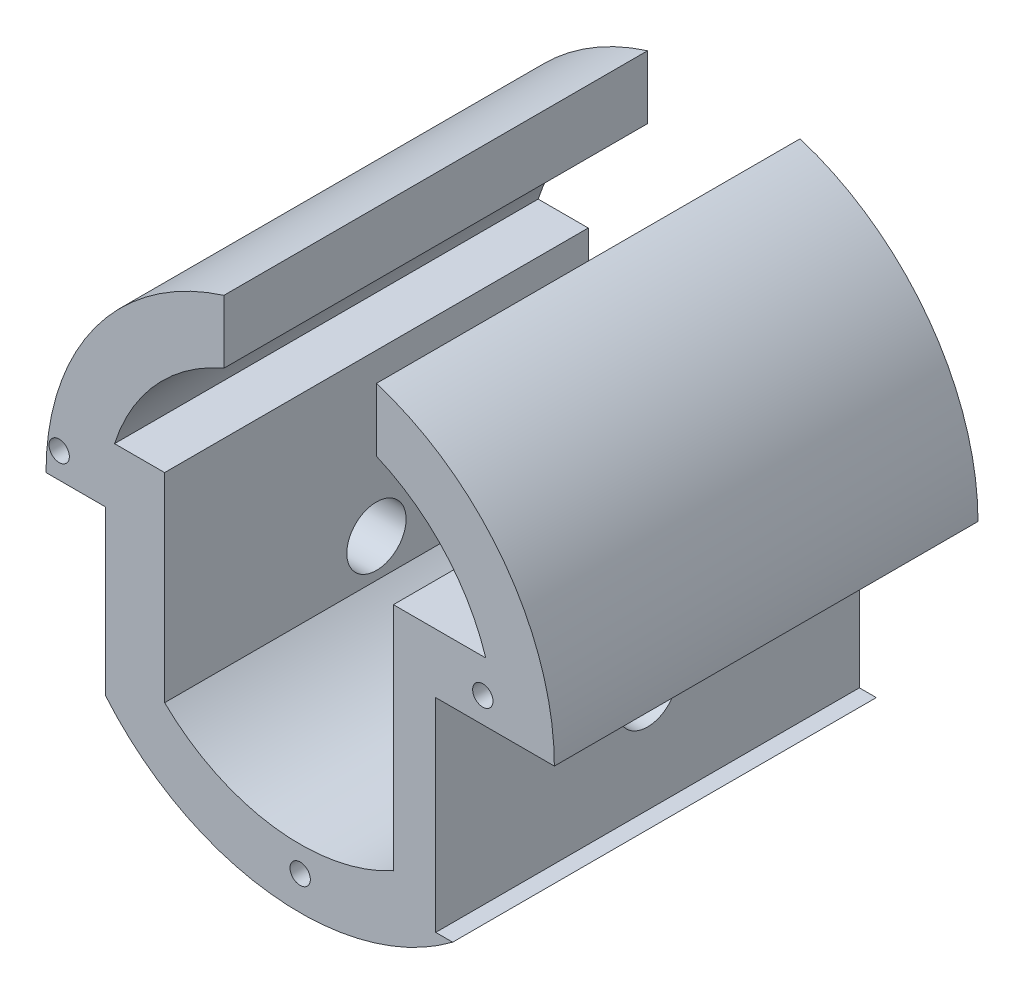
ISO-10303-21;
HEADER;
FILE_DESCRIPTION(('STEP AP214'),'2;1');
FILE_NAME('part.step','',(''),(''),'','','');
FILE_SCHEMA(('AUTOMOTIVE_DESIGN { 1 0 10303 214 1 1 1 1 }'));
ENDSEC;
DATA;
#1=APPLICATION_CONTEXT('core data for automotive mechanical design processes');
#2=APPLICATION_PROTOCOL_DEFINITION('international standard','automotive_design',2000,#1);
#3=PRODUCT_CONTEXT('',#1,'mechanical');
#4=PRODUCT('Part','Part','',(#3));
#5=PRODUCT_RELATED_PRODUCT_CATEGORY('part','',(#4));
#6=PRODUCT_DEFINITION_FORMATION('','',#4);
#7=PRODUCT_DEFINITION_CONTEXT('part definition',#1,'design');
#8=PRODUCT_DEFINITION('design','',#6,#7);
#9=PRODUCT_DEFINITION_SHAPE('','',#8);
#10=(LENGTH_UNIT() NAMED_UNIT(*) SI_UNIT(.MILLI.,.METRE.));
#11=(NAMED_UNIT(*) PLANE_ANGLE_UNIT() SI_UNIT($,.RADIAN.));
#12=(NAMED_UNIT(*) SI_UNIT($,.STERADIAN.) SOLID_ANGLE_UNIT());
#13=UNCERTAINTY_MEASURE_WITH_UNIT(LENGTH_MEASURE(1.E-05),#10,'distance_accuracy_value','');
#14=(GEOMETRIC_REPRESENTATION_CONTEXT(3) GLOBAL_UNCERTAINTY_ASSIGNED_CONTEXT((#13)) GLOBAL_UNIT_ASSIGNED_CONTEXT((#10,
#11,#12)) REPRESENTATION_CONTEXT('',''));
#15=CARTESIAN_POINT('',(0.,0.,0.));
#16=DIRECTION('',(0.,0.,1.));
#17=DIRECTION('',(1.,0.,0.));
#18=AXIS2_PLACEMENT_3D('',#15,#16,#17);
#19=CARTESIAN_POINT('',(18.,-12.,25.));
#20=DIRECTION('',(1.,0.,0.));
#21=DIRECTION('',(0.,0.,-1.));
#22=AXIS2_PLACEMENT_3D('',#19,#20,#21);
#23=CYLINDRICAL_SURFACE('',#22,3.49999998499999);
#24=CARTESIAN_POINT('',(11.,-12.,25.));
#25=DIRECTION('',(1.,0.,0.));
#26=DIRECTION('',(0.,1.,0.));
#27=AXIS2_PLACEMENT_3D('',#24,#25,#26);
#28=CIRCLE('',#27,3.49999998499999);
#29=CARTESIAN_POINT('',(11.,-8.500000015,25.));
#30=VERTEX_POINT('',#29);
#31=EDGE_CURVE('E254',#30,#30,#28,.T.);
#32=ORIENTED_EDGE('',*,*,#31,.F.);
#33=EDGE_LOOP('',(#32));
#34=FACE_BOUND('',#33,.T.);
#35=CARTESIAN_POINT('',(16.,-12.,25.));
#36=DIRECTION('',(1.,0.,0.));
#37=DIRECTION('',(0.,1.,0.));
#38=AXIS2_PLACEMENT_3D('',#35,#36,#37);
#39=CIRCLE('',#38,3.49999998499999);
#40=CARTESIAN_POINT('',(16.,-8.500000015,25.));
#41=VERTEX_POINT('',#40);
#42=EDGE_CURVE('E42',#41,#41,#39,.F.);
#43=ORIENTED_EDGE('',*,*,#42,.F.);
#44=EDGE_LOOP('',(#43));
#45=FACE_BOUND('',#44,.T.);
#46=ADVANCED_FACE('F38',(#34,#45),#23,.F.);
#47=CARTESIAN_POINT('',(0.,0.,50.));
#48=DIRECTION('',(0.,0.,-1.));
#49=DIRECTION('',(-1.,0.,0.));
#50=AXIS2_PLACEMENT_3D('',#47,#48,#49);
#51=CYLINDRICAL_SURFACE('',#50,23.);
#52=DIRECTION('',(0.,0.,-1.));
#53=VECTOR('',#52,1.);
#54=CARTESIAN_POINT('',(9.00000000000001,21.1660104885167,50.));
#55=LINE('',#54,#53);
#56=CARTESIAN_POINT('',(9.00000000000001,21.1660104885167,0.));
#57=VERTEX_POINT('',#56);
#58=CARTESIAN_POINT('',(9.00000000000001,21.1660104885167,50.));
#59=VERTEX_POINT('',#58);
#60=EDGE_CURVE('E11',#57,#59,#55,.F.);
#61=ORIENTED_EDGE('',*,*,#60,.F.);
#62=CARTESIAN_POINT('',(0.,0.,0.));
#63=DIRECTION('',(0.,0.,1.));
#64=DIRECTION('',(1.,0.,0.));
#65=AXIS2_PLACEMENT_3D('',#62,#63,#64);
#66=CIRCLE('',#65,23.);
#67=CARTESIAN_POINT('',(21.9089023002066,7.,0.));
#68=VERTEX_POINT('',#67);
#69=EDGE_CURVE('E289',#68,#57,#66,.T.);
#70=ORIENTED_EDGE('',*,*,#69,.F.);
#71=DIRECTION('',(0.,0.,-1.));
#72=VECTOR('',#71,1.);
#73=CARTESIAN_POINT('',(21.9089023002066,7.,50.));
#74=LINE('',#73,#72);
#75=CARTESIAN_POINT('',(21.9089023002066,7.,50.));
#76=VERTEX_POINT('',#75);
#77=EDGE_CURVE('E258',#76,#68,#74,.T.);
#78=ORIENTED_EDGE('',*,*,#77,.F.);
#79=CARTESIAN_POINT('',(0.,0.,50.));
#80=DIRECTION('',(0.,0.,1.));
#81=DIRECTION('',(1.,0.,0.));
#82=AXIS2_PLACEMENT_3D('',#79,#80,#81);
#83=CIRCLE('',#82,23.);
#84=EDGE_CURVE('E290',#76,#59,#83,.T.);
#85=ORIENTED_EDGE('',*,*,#84,.T.);
#86=EDGE_LOOP('',(#61,#70,#78,#85));
#87=FACE_BOUND('',#86,.T.);
#88=ADVANCED_FACE('F382',(#87),#51,.F.);
#89=CARTESIAN_POINT('',(0.,0.,50.));
#90=DIRECTION('',(0.,0.,1.));
#91=DIRECTION('',(1.,0.,0.));
#92=AXIS2_PLACEMENT_3D('',#89,#90,#91);
#93=PLANE('',#92);
#94=DIRECTION('',(0.,-1.,0.));
#95=VECTOR('',#94,1.);
#96=CARTESIAN_POINT('',(16.,0.,50.));
#97=LINE('',#96,#95);
#98=CARTESIAN_POINT('',(16.,0.,50.));
#99=VERTEX_POINT('',#98);
#100=CARTESIAN_POINT('',(16.,-24.,50.));
#101=VERTEX_POINT('',#100);
#102=EDGE_CURVE('E186',#99,#101,#97,.T.);
#103=ORIENTED_EDGE('',*,*,#102,.F.);
#104=DIRECTION('',(-1.,0.,0.));
#105=VECTOR('',#104,1.);
#106=CARTESIAN_POINT('',(0.,0.,50.));
#107=LINE('',#106,#105);
#108=CARTESIAN_POINT('',(30.,0.,50.));
#109=VERTEX_POINT('',#108);
#110=EDGE_CURVE('E307',#109,#99,#107,.T.);
#111=ORIENTED_EDGE('',*,*,#110,.F.);
#112=CARTESIAN_POINT('',(0.,0.,50.));
#113=DIRECTION('',(0.,0.,1.));
#114=DIRECTION('',(1.,0.,0.));
#115=AXIS2_PLACEMENT_3D('',#112,#113,#114);
#116=CIRCLE('',#115,30.);
#117=CARTESIAN_POINT('',(9.00000000000001,28.6181760425084,50.));
#118=VERTEX_POINT('',#117);
#119=EDGE_CURVE('E309',#109,#118,#116,.T.);
#120=ORIENTED_EDGE('',*,*,#119,.T.);
#121=DIRECTION('',(0.,1.,0.));
#122=VECTOR('',#121,1.);
#123=CARTESIAN_POINT('',(9.00000000000001,18.6181760425084,50.));
#124=LINE('',#123,#122);
#125=EDGE_CURVE('E242',#59,#118,#124,.T.);
#126=ORIENTED_EDGE('',*,*,#125,.F.);
#127=ORIENTED_EDGE('',*,*,#84,.F.);
#128=DIRECTION('',(-1.,0.,0.));
#129=VECTOR('',#128,1.);
#130=CARTESIAN_POINT('',(0.,7.,50.));
#131=LINE('',#130,#129);
#132=CARTESIAN_POINT('',(11.,7.,50.));
#133=VERTEX_POINT('',#132);
#134=EDGE_CURVE('E279',#76,#133,#131,.T.);
#135=ORIENTED_EDGE('',*,*,#134,.T.);
#136=DIRECTION('',(0.,-1.,0.));
#137=VECTOR('',#136,1.);
#138=CARTESIAN_POINT('',(11.,0.,50.));
#139=LINE('',#138,#137);
#140=CARTESIAN_POINT('',(11.,-20.1990098767242,50.));
#141=VERTEX_POINT('',#140);
#142=EDGE_CURVE('E265',#133,#141,#139,.T.);
#143=ORIENTED_EDGE('',*,*,#142,.T.);
#144=CARTESIAN_POINT('',(0.,0.,50.));
#145=DIRECTION('',(0.,0.,1.));
#146=DIRECTION('',(1.,0.,0.));
#147=AXIS2_PLACEMENT_3D('',#144,#145,#146);
#148=CIRCLE('',#147,23.);
#149=CARTESIAN_POINT('',(-16.,-16.5227116418583,50.));
#150=VERTEX_POINT('',#149);
#151=EDGE_CURVE('E298',#150,#141,#148,.T.);
#152=ORIENTED_EDGE('',*,*,#151,.F.);
#153=DIRECTION('',(0.,-1.,0.));
#154=VECTOR('',#153,1.);
#155=CARTESIAN_POINT('',(-16.,0.,50.));
#156=LINE('',#155,#154);
#157=CARTESIAN_POINT('',(-16.,6.99999999999952,50.));
#158=VERTEX_POINT('',#157);
#159=EDGE_CURVE('E296',#158,#150,#156,.T.);
#160=ORIENTED_EDGE('',*,*,#159,.F.);
#161=DIRECTION('',(1.,0.,0.));
#162=VECTOR('',#161,1.);
#163=CARTESIAN_POINT('',(-2.09488880330588E-13,7.,50.));
#164=LINE('',#163,#162);
#165=CARTESIAN_POINT('',(-21.9089023002069,6.99999999999934,50.));
#166=VERTEX_POINT('',#165);
#167=EDGE_CURVE('E293',#166,#158,#164,.T.);
#168=ORIENTED_EDGE('',*,*,#167,.F.);
#169=CARTESIAN_POINT('',(-9.,21.1660104885167,50.));
#170=VERTEX_POINT('',#169);
#171=EDGE_CURVE('E294',#170,#166,#83,.T.);
#172=ORIENTED_EDGE('',*,*,#171,.F.);
#173=DIRECTION('',(0.,1.,0.));
#174=VECTOR('',#173,1.);
#175=CARTESIAN_POINT('',(-9.,18.6181760425084,50.));
#176=LINE('',#175,#174);
#177=CARTESIAN_POINT('',(-9.,28.6181760425084,50.));
#178=VERTEX_POINT('',#177);
#179=EDGE_CURVE('E54',#170,#178,#176,.T.);
#180=ORIENTED_EDGE('',*,*,#179,.T.);
#181=CARTESIAN_POINT('',(-30.,-8.97809487131092E-13,50.));
#182=VERTEX_POINT('',#181);
#183=EDGE_CURVE('E313',#178,#182,#116,.T.);
#184=ORIENTED_EDGE('',*,*,#183,.T.);
#185=DIRECTION('',(1.,0.,0.));
#186=VECTOR('',#185,1.);
#187=CARTESIAN_POINT('',(0.,0.,50.));
#188=LINE('',#187,#186);
#189=CARTESIAN_POINT('',(-23.,-6.88320606800504E-13,50.));
#190=VERTEX_POINT('',#189);
#191=EDGE_CURVE('E314',#182,#190,#188,.T.);
#192=ORIENTED_EDGE('',*,*,#191,.T.);
#193=DIRECTION('',(0.,-1.,0.));
#194=VECTOR('',#193,1.);
#195=CARTESIAN_POINT('',(-23.,0.,50.));
#196=LINE('',#195,#194);
#197=CARTESIAN_POINT('',(-23.,-19.2613602842582,50.));
#198=VERTEX_POINT('',#197);
#199=EDGE_CURVE('E316',#190,#198,#196,.T.);
#200=ORIENTED_EDGE('',*,*,#199,.T.);
#201=CARTESIAN_POINT('',(18.,-24.,50.));
#202=VERTEX_POINT('',#201);
#203=EDGE_CURVE('E200',#198,#202,#116,.T.);
#204=ORIENTED_EDGE('',*,*,#203,.T.);
#205=DIRECTION('',(1.,0.,0.));
#206=VECTOR('',#205,1.);
#207=CARTESIAN_POINT('',(16.,-24.,50.));
#208=LINE('',#207,#206);
#209=EDGE_CURVE('E178',#101,#202,#208,.T.);
#210=ORIENTED_EDGE('',*,*,#209,.F.);
#211=EDGE_LOOP('',(#103,#111,#120,#126,#127,#135,#143,#152,#160,#168,#172,#180,#184,#192,#200,
#204,#210));
#212=FACE_BOUND('',#211,.T.);
#213=CARTESIAN_POINT('',(0.,-26.,50.));
#214=DIRECTION('',(0.,0.,1.));
#215=DIRECTION('',(1.,0.,0.));
#216=AXIS2_PLACEMENT_3D('',#213,#214,#215);
#217=CIRCLE('',#216,1.19999999999999);
#218=CARTESIAN_POINT('',(1.19999999999999,-26.,50.));
#219=VERTEX_POINT('',#218);
#220=EDGE_CURVE('E224',#219,#219,#217,.T.);
#221=ORIENTED_EDGE('',*,*,#220,.F.);
#222=EDGE_LOOP('',(#221));
#223=FACE_BOUND('',#222,.T.);
#224=CARTESIAN_POINT('',(-28.4443688230068,2.99999999999952,50.));
#225=DIRECTION('',(0.,0.,1.));
#226=DIRECTION('',(1.,0.,0.));
#227=AXIS2_PLACEMENT_3D('',#224,#225,#226);
#228=CIRCLE('',#227,1.19999999999999);
#229=CARTESIAN_POINT('',(-27.2443688230068,2.99999999999952,50.));
#230=VERTEX_POINT('',#229);
#231=EDGE_CURVE('E230',#230,#230,#228,.T.);
#232=ORIENTED_EDGE('',*,*,#231,.F.);
#233=EDGE_LOOP('',(#232));
#234=FACE_BOUND('',#233,.T.);
#235=CARTESIAN_POINT('',(21.5556311769932,2.99999999999952,50.));
#236=DIRECTION('',(0.,0.,1.));
#237=DIRECTION('',(1.,0.,0.));
#238=AXIS2_PLACEMENT_3D('',#235,#236,#237);
#239=CIRCLE('',#238,1.19999999999999);
#240=CARTESIAN_POINT('',(22.7556311769932,2.99999999999952,50.));
#241=VERTEX_POINT('',#240);
#242=EDGE_CURVE('E236',#241,#241,#239,.T.);
#243=ORIENTED_EDGE('',*,*,#242,.F.);
#244=EDGE_LOOP('',(#243));
#245=FACE_BOUND('',#244,.T.);
#246=ADVANCED_FACE('F197',(#212,#223,#234,#245),#93,.T.);
#247=CARTESIAN_POINT('',(0.,0.,0.));
#248=DIRECTION('',(0.,0.,1.));
#249=DIRECTION('',(1.,0.,0.));
#250=AXIS2_PLACEMENT_3D('',#247,#248,#249);
#251=PLANE('',#250);
#252=DIRECTION('',(-1.,0.,0.));
#253=VECTOR('',#252,1.);
#254=CARTESIAN_POINT('',(0.,0.,0.));
#255=LINE('',#254,#253);
#256=CARTESIAN_POINT('',(30.,0.,0.));
#257=VERTEX_POINT('',#256);
#258=CARTESIAN_POINT('',(16.,0.,0.));
#259=VERTEX_POINT('',#258);
#260=EDGE_CURVE('E260',#257,#259,#255,.T.);
#261=ORIENTED_EDGE('',*,*,#260,.T.);
#262=DIRECTION('',(0.,1.,0.));
#263=VECTOR('',#262,1.);
#264=CARTESIAN_POINT('',(16.,0.,0.));
#265=LINE('',#264,#263);
#266=CARTESIAN_POINT('',(16.,-24.,0.));
#267=VERTEX_POINT('',#266);
#268=EDGE_CURVE('E185',#267,#259,#265,.T.);
#269=ORIENTED_EDGE('',*,*,#268,.F.);
#270=DIRECTION('',(1.,0.,0.));
#271=VECTOR('',#270,1.);
#272=CARTESIAN_POINT('',(16.,-24.,0.));
#273=LINE('',#272,#271);
#274=CARTESIAN_POINT('',(18.,-24.,0.));
#275=VERTEX_POINT('',#274);
#276=EDGE_CURVE('E181',#267,#275,#273,.T.);
#277=ORIENTED_EDGE('',*,*,#276,.T.);
#278=CARTESIAN_POINT('',(0.,0.,0.));
#279=DIRECTION('',(0.,0.,1.));
#280=DIRECTION('',(1.,0.,0.));
#281=AXIS2_PLACEMENT_3D('',#278,#279,#280);
#282=CIRCLE('',#281,30.);
#283=CARTESIAN_POINT('',(-23.,-19.2613602842582,0.));
#284=VERTEX_POINT('',#283);
#285=EDGE_CURVE('E310',#284,#275,#282,.T.);
#286=ORIENTED_EDGE('',*,*,#285,.F.);
#287=DIRECTION('',(0.,-1.,0.));
#288=VECTOR('',#287,1.);
#289=CARTESIAN_POINT('',(-23.,0.,0.));
#290=LINE('',#289,#288);
#291=CARTESIAN_POINT('',(-23.,-6.88320606800504E-13,0.));
#292=VERTEX_POINT('',#291);
#293=EDGE_CURVE('E325',#292,#284,#290,.T.);
#294=ORIENTED_EDGE('',*,*,#293,.F.);
#295=DIRECTION('',(1.,0.,0.));
#296=VECTOR('',#295,1.);
#297=CARTESIAN_POINT('',(0.,0.,0.));
#298=LINE('',#297,#296);
#299=CARTESIAN_POINT('',(-30.,-8.97809487131092E-13,0.));
#300=VERTEX_POINT('',#299);
#301=EDGE_CURVE('E323',#300,#292,#298,.T.);
#302=ORIENTED_EDGE('',*,*,#301,.F.);
#303=CARTESIAN_POINT('',(-9.,28.6181760425084,0.));
#304=VERTEX_POINT('',#303);
#305=EDGE_CURVE('E322',#304,#300,#282,.T.);
#306=ORIENTED_EDGE('',*,*,#305,.F.);
#307=DIRECTION('',(0.,1.,0.));
#308=VECTOR('',#307,1.);
#309=CARTESIAN_POINT('',(-9.,18.6181760425084,0.));
#310=LINE('',#309,#308);
#311=CARTESIAN_POINT('',(-9.,21.1660104885167,0.));
#312=VERTEX_POINT('',#311);
#313=EDGE_CURVE('E246',#312,#304,#310,.T.);
#314=ORIENTED_EDGE('',*,*,#313,.F.);
#315=CARTESIAN_POINT('',(-21.9089023002069,6.99999999999934,0.));
#316=VERTEX_POINT('',#315);
#317=EDGE_CURVE('E275',#312,#316,#66,.T.);
#318=ORIENTED_EDGE('',*,*,#317,.T.);
#319=DIRECTION('',(1.,0.,0.));
#320=VECTOR('',#319,1.);
#321=CARTESIAN_POINT('',(-2.09488880330588E-13,7.,0.));
#322=LINE('',#321,#320);
#323=CARTESIAN_POINT('',(-16.,6.99999999999952,0.));
#324=VERTEX_POINT('',#323);
#325=EDGE_CURVE('E286',#316,#324,#322,.T.);
#326=ORIENTED_EDGE('',*,*,#325,.T.);
#327=DIRECTION('',(0.,-1.,0.));
#328=VECTOR('',#327,1.);
#329=CARTESIAN_POINT('',(-16.,0.,0.));
#330=LINE('',#329,#328);
#331=CARTESIAN_POINT('',(-16.,-16.5227116418583,0.));
#332=VERTEX_POINT('',#331);
#333=EDGE_CURVE('E283',#324,#332,#330,.T.);
#334=ORIENTED_EDGE('',*,*,#333,.T.);
#335=CARTESIAN_POINT('',(0.,0.,0.));
#336=DIRECTION('',(0.,0.,1.));
#337=DIRECTION('',(1.,0.,0.));
#338=AXIS2_PLACEMENT_3D('',#335,#336,#337);
#339=CIRCLE('',#338,23.);
#340=CARTESIAN_POINT('',(11.,-20.1990098767242,0.));
#341=VERTEX_POINT('',#340);
#342=EDGE_CURVE('E280',#332,#341,#339,.T.);
#343=ORIENTED_EDGE('',*,*,#342,.T.);
#344=DIRECTION('',(0.,-1.,0.));
#345=VECTOR('',#344,1.);
#346=CARTESIAN_POINT('',(11.,0.,0.));
#347=LINE('',#346,#345);
#348=CARTESIAN_POINT('',(11.,7.,0.));
#349=VERTEX_POINT('',#348);
#350=EDGE_CURVE('E276',#349,#341,#347,.T.);
#351=ORIENTED_EDGE('',*,*,#350,.F.);
#352=DIRECTION('',(-1.,0.,0.));
#353=VECTOR('',#352,1.);
#354=CARTESIAN_POINT('',(0.,7.,0.));
#355=LINE('',#354,#353);
#356=EDGE_CURVE('E257',#68,#349,#355,.T.);
#357=ORIENTED_EDGE('',*,*,#356,.F.);
#358=ORIENTED_EDGE('',*,*,#69,.T.);
#359=DIRECTION('',(0.,1.,0.));
#360=VECTOR('',#359,1.);
#361=CARTESIAN_POINT('',(9.00000000000001,18.6181760425084,0.));
#362=LINE('',#361,#360);
#363=CARTESIAN_POINT('',(9.00000000000001,28.6181760425084,0.));
#364=VERTEX_POINT('',#363);
#365=EDGE_CURVE('E61',#57,#364,#362,.T.);
#366=ORIENTED_EDGE('',*,*,#365,.T.);
#367=EDGE_CURVE('E319',#257,#364,#282,.T.);
#368=ORIENTED_EDGE('',*,*,#367,.F.);
#369=EDGE_LOOP('',(#261,#269,#277,#286,#294,#302,#306,#314,#318,#326,#334,#343,#351,#357,#358,
#366,#368));
#370=FACE_BOUND('',#369,.T.);
#371=CARTESIAN_POINT('',(0.,-26.,0.));
#372=DIRECTION('',(0.,0.,-1.));
#373=DIRECTION('',(-1.,0.,0.));
#374=AXIS2_PLACEMENT_3D('',#371,#372,#373);
#375=CIRCLE('',#374,1.19999999999999);
#376=CARTESIAN_POINT('',(-1.2,-26.,0.));
#377=VERTEX_POINT('',#376);
#378=EDGE_CURVE('E206',#377,#377,#375,.T.);
#379=ORIENTED_EDGE('',*,*,#378,.F.);
#380=EDGE_LOOP('',(#379));
#381=FACE_BOUND('',#380,.T.);
#382=CARTESIAN_POINT('',(25.,3.,0.));
#383=DIRECTION('',(0.,0.,-1.));
#384=DIRECTION('',(-1.,0.,0.));
#385=AXIS2_PLACEMENT_3D('',#382,#383,#384);
#386=CIRCLE('',#385,1.19999999999999);
#387=CARTESIAN_POINT('',(23.8,3.,0.));
#388=VERTEX_POINT('',#387);
#389=EDGE_CURVE('E212',#388,#388,#386,.T.);
#390=ORIENTED_EDGE('',*,*,#389,.F.);
#391=EDGE_LOOP('',(#390));
#392=FACE_BOUND('',#391,.T.);
#393=CARTESIAN_POINT('',(-25.,3.00000000000001,0.));
#394=DIRECTION('',(0.,0.,-1.));
#395=DIRECTION('',(-1.,0.,0.));
#396=AXIS2_PLACEMENT_3D('',#393,#394,#395);
#397=CIRCLE('',#396,1.19999999999999);
#398=CARTESIAN_POINT('',(-26.2,3.00000000000001,0.));
#399=VERTEX_POINT('',#398);
#400=EDGE_CURVE('E218',#399,#399,#397,.T.);
#401=ORIENTED_EDGE('',*,*,#400,.F.);
#402=EDGE_LOOP('',(#401));
#403=FACE_BOUND('',#402,.T.);
#404=ADVANCED_FACE('F352',(#370,#381,#392,#403),#251,.F.);
#405=CARTESIAN_POINT('',(0.,0.,50.));
#406=DIRECTION('',(0.,-1.,0.));
#407=DIRECTION('',(1.,0.,0.));
#408=AXIS2_PLACEMENT_3D('',#405,#406,#407);
#409=PLANE('',#408);
#410=ORIENTED_EDGE('',*,*,#260,.F.);
#411=DIRECTION('',(0.,0.,-1.));
#412=VECTOR('',#411,1.);
#413=CARTESIAN_POINT('',(30.,0.,50.));
#414=LINE('',#413,#412);
#415=EDGE_CURVE('E343',#109,#257,#414,.T.);
#416=ORIENTED_EDGE('',*,*,#415,.F.);
#417=ORIENTED_EDGE('',*,*,#110,.T.);
#418=DIRECTION('',(0.,0.,1.));
#419=VECTOR('',#418,1.);
#420=CARTESIAN_POINT('',(16.,0.,50.));
#421=LINE('',#420,#419);
#422=EDGE_CURVE('E193',#259,#99,#421,.T.);
#423=ORIENTED_EDGE('',*,*,#422,.F.);
#424=EDGE_LOOP('',(#410,#416,#417,#423));
#425=FACE_BOUND('',#424,.T.);
#426=ADVANCED_FACE('F40',(#425),#409,.T.);
#427=CARTESIAN_POINT('',(0.,0.,50.));
#428=DIRECTION('',(0.,0.,-1.));
#429=DIRECTION('',(-1.,0.,0.));
#430=AXIS2_PLACEMENT_3D('',#427,#428,#429);
#431=CYLINDRICAL_SURFACE('',#430,30.);
#432=ORIENTED_EDGE('',*,*,#367,.T.);
#433=DIRECTION('',(0.,0.,-1.));
#434=VECTOR('',#433,1.);
#435=CARTESIAN_POINT('',(9.00000000000001,28.6181760425084,50.));
#436=LINE('',#435,#434);
#437=EDGE_CURVE('E341',#118,#364,#436,.T.);
#438=ORIENTED_EDGE('',*,*,#437,.F.);
#439=ORIENTED_EDGE('',*,*,#119,.F.);
#440=ORIENTED_EDGE('',*,*,#415,.T.);
#441=EDGE_LOOP('',(#432,#438,#439,#440));
#442=FACE_BOUND('',#441,.T.);
#443=ADVANCED_FACE('F387',(#442),#431,.T.);
#444=ORIENTED_EDGE('',*,*,#305,.T.);
#445=DIRECTION('',(0.,0.,-1.));
#446=VECTOR('',#445,1.);
#447=CARTESIAN_POINT('',(-30.,-8.97809487131092E-13,50.));
#448=LINE('',#447,#446);
#449=EDGE_CURVE('E335',#182,#300,#448,.T.);
#450=ORIENTED_EDGE('',*,*,#449,.F.);
#451=ORIENTED_EDGE('',*,*,#183,.F.);
#452=DIRECTION('',(0.,0.,-1.));
#453=VECTOR('',#452,1.);
#454=CARTESIAN_POINT('',(-9.,28.6181760425084,50.));
#455=LINE('',#454,#453);
#456=EDGE_CURVE('E338',#178,#304,#455,.T.);
#457=ORIENTED_EDGE('',*,*,#456,.T.);
#458=EDGE_LOOP('',(#444,#450,#451,#457));
#459=FACE_BOUND('',#458,.T.);
#460=ADVANCED_FACE('F399',(#459),#431,.T.);
#461=CARTESIAN_POINT('',(0.,0.,50.));
#462=DIRECTION('',(0.,1.,0.));
#463=DIRECTION('',(-1.,0.,0.));
#464=AXIS2_PLACEMENT_3D('',#461,#462,#463);
#465=PLANE('',#464);
#466=ORIENTED_EDGE('',*,*,#301,.T.);
#467=DIRECTION('',(0.,0.,-1.));
#468=VECTOR('',#467,1.);
#469=CARTESIAN_POINT('',(-23.,-6.88320606800504E-13,50.));
#470=LINE('',#469,#468);
#471=EDGE_CURVE('E332',#190,#292,#470,.T.);
#472=ORIENTED_EDGE('',*,*,#471,.F.);
#473=ORIENTED_EDGE('',*,*,#191,.F.);
#474=ORIENTED_EDGE('',*,*,#449,.T.);
#475=EDGE_LOOP('',(#466,#472,#473,#474));
#476=FACE_BOUND('',#475,.T.);
#477=ADVANCED_FACE('F403',(#476),#465,.F.);
#478=CARTESIAN_POINT('',(-23.,0.,50.));
#479=DIRECTION('',(1.,0.,0.));
#480=DIRECTION('',(0.,1.,0.));
#481=AXIS2_PLACEMENT_3D('',#478,#479,#480);
#482=PLANE('',#481);
#483=CARTESIAN_POINT('',(-23.,-12.,25.));
#484=DIRECTION('',(1.,0.,0.));
#485=DIRECTION('',(0.,1.,0.));
#486=AXIS2_PLACEMENT_3D('',#483,#484,#485);
#487=CIRCLE('',#486,3.49999998499999);
#488=CARTESIAN_POINT('',(-23.,-8.500000015,25.));
#489=VERTEX_POINT('',#488);
#490=EDGE_CURVE('E244',#489,#489,#487,.T.);
#491=ORIENTED_EDGE('',*,*,#490,.T.);
#492=EDGE_LOOP('',(#491));
#493=FACE_BOUND('',#492,.T.);
#494=ORIENTED_EDGE('',*,*,#293,.T.);
#495=DIRECTION('',(0.,0.,-1.));
#496=VECTOR('',#495,1.);
#497=CARTESIAN_POINT('',(-23.,-19.2613602842582,50.));
#498=LINE('',#497,#496);
#499=EDGE_CURVE('E329',#198,#284,#498,.T.);
#500=ORIENTED_EDGE('',*,*,#499,.F.);
#501=ORIENTED_EDGE('',*,*,#199,.F.);
#502=ORIENTED_EDGE('',*,*,#471,.T.);
#503=EDGE_LOOP('',(#494,#500,#501,#502));
#504=FACE_BOUND('',#503,.T.);
#505=ADVANCED_FACE('F406',(#493,#504),#482,.F.);
#506=ORIENTED_EDGE('',*,*,#285,.T.);
#507=DIRECTION('',(0.,0.,-1.));
#508=VECTOR('',#507,1.);
#509=CARTESIAN_POINT('',(18.,-24.,50.));
#510=LINE('',#509,#508);
#511=EDGE_CURVE('E327',#202,#275,#510,.T.);
#512=ORIENTED_EDGE('',*,*,#511,.F.);
#513=ORIENTED_EDGE('',*,*,#203,.F.);
#514=ORIENTED_EDGE('',*,*,#499,.T.);
#515=EDGE_LOOP('',(#506,#512,#513,#514));
#516=FACE_BOUND('',#515,.T.);
#517=ADVANCED_FACE('F395',(#516),#431,.T.);
#518=CARTESIAN_POINT('',(0.,7.,50.));
#519=DIRECTION('',(0.,-1.,0.));
#520=DIRECTION('',(1.,0.,0.));
#521=AXIS2_PLACEMENT_3D('',#518,#519,#520);
#522=PLANE('',#521);
#523=ORIENTED_EDGE('',*,*,#356,.T.);
#524=DIRECTION('',(0.,0.,-1.));
#525=VECTOR('',#524,1.);
#526=CARTESIAN_POINT('',(11.,7.,50.));
#527=LINE('',#526,#525);
#528=EDGE_CURVE('E262',#133,#349,#527,.T.);
#529=ORIENTED_EDGE('',*,*,#528,.F.);
#530=ORIENTED_EDGE('',*,*,#134,.F.);
#531=ORIENTED_EDGE('',*,*,#77,.T.);
#532=EDGE_LOOP('',(#523,#529,#530,#531));
#533=FACE_BOUND('',#532,.T.);
#534=ADVANCED_FACE('F378',(#533),#522,.F.);
#535=DIRECTION('',(0.,0.,-1.));
#536=VECTOR('',#535,1.);
#537=CARTESIAN_POINT('',(-9.,21.1660104885167,50.));
#538=LINE('',#537,#536);
#539=EDGE_CURVE('E47',#170,#312,#538,.T.);
#540=ORIENTED_EDGE('',*,*,#539,.F.);
#541=ORIENTED_EDGE('',*,*,#171,.T.);
#542=DIRECTION('',(0.,0.,-1.));
#543=VECTOR('',#542,1.);
#544=CARTESIAN_POINT('',(-21.9089023002069,6.99999999999934,50.));
#545=LINE('',#544,#543);
#546=EDGE_CURVE('E261',#166,#316,#545,.T.);
#547=ORIENTED_EDGE('',*,*,#546,.T.);
#548=ORIENTED_EDGE('',*,*,#317,.F.);
#549=EDGE_LOOP('',(#540,#541,#547,#548));
#550=FACE_BOUND('',#549,.T.);
#551=ADVANCED_FACE('F356',(#550),#51,.F.);
#552=CARTESIAN_POINT('',(-2.09488880330588E-13,7.,50.));
#553=DIRECTION('',(0.,1.,0.));
#554=DIRECTION('',(-1.,0.,0.));
#555=AXIS2_PLACEMENT_3D('',#552,#553,#554);
#556=PLANE('',#555);
#557=ORIENTED_EDGE('',*,*,#325,.F.);
#558=ORIENTED_EDGE('',*,*,#546,.F.);
#559=ORIENTED_EDGE('',*,*,#167,.T.);
#560=DIRECTION('',(0.,0.,-1.));
#561=VECTOR('',#560,1.);
#562=CARTESIAN_POINT('',(-16.,6.99999999999952,50.));
#563=LINE('',#562,#561);
#564=EDGE_CURVE('E269',#158,#324,#563,.T.);
#565=ORIENTED_EDGE('',*,*,#564,.T.);
#566=EDGE_LOOP('',(#557,#558,#559,#565));
#567=FACE_BOUND('',#566,.T.);
#568=ADVANCED_FACE('F360',(#567),#556,.T.);
#569=CARTESIAN_POINT('',(-16.,0.,50.));
#570=DIRECTION('',(1.,0.,0.));
#571=DIRECTION('',(0.,1.,0.));
#572=AXIS2_PLACEMENT_3D('',#569,#570,#571);
#573=PLANE('',#572);
#574=CARTESIAN_POINT('',(-16.,-12.,25.));
#575=DIRECTION('',(1.,0.,0.));
#576=DIRECTION('',(0.,1.,0.));
#577=AXIS2_PLACEMENT_3D('',#574,#575,#576);
#578=CIRCLE('',#577,3.49999998499999);
#579=CARTESIAN_POINT('',(-16.,-8.500000015,25.));
#580=VERTEX_POINT('',#579);
#581=EDGE_CURVE('E251',#580,#580,#578,.T.);
#582=ORIENTED_EDGE('',*,*,#581,.F.);
#583=EDGE_LOOP('',(#582));
#584=FACE_BOUND('',#583,.T.);
#585=ORIENTED_EDGE('',*,*,#333,.F.);
#586=ORIENTED_EDGE('',*,*,#564,.F.);
#587=ORIENTED_EDGE('',*,*,#159,.T.);
#588=DIRECTION('',(0.,0.,-1.));
#589=VECTOR('',#588,1.);
#590=CARTESIAN_POINT('',(-16.,-16.5227116418583,50.));
#591=LINE('',#590,#589);
#592=EDGE_CURVE('E267',#150,#332,#591,.T.);
#593=ORIENTED_EDGE('',*,*,#592,.T.);
#594=EDGE_LOOP('',(#585,#586,#587,#593));
#595=FACE_BOUND('',#594,.T.);
#596=ADVANCED_FACE('F367',(#584,#595),#573,.T.);
#597=ORIENTED_EDGE('',*,*,#342,.F.);
#598=ORIENTED_EDGE('',*,*,#592,.F.);
#599=ORIENTED_EDGE('',*,*,#151,.T.);
#600=DIRECTION('',(0.,0.,-1.));
#601=VECTOR('',#600,1.);
#602=CARTESIAN_POINT('',(11.,-20.1990098767242,50.));
#603=LINE('',#602,#601);
#604=EDGE_CURVE('E264',#141,#341,#603,.T.);
#605=ORIENTED_EDGE('',*,*,#604,.T.);
#606=EDGE_LOOP('',(#597,#598,#599,#605));
#607=FACE_BOUND('',#606,.T.);
#608=ADVANCED_FACE('F370',(#607),#51,.F.);
#609=CARTESIAN_POINT('',(11.,0.,50.));
#610=DIRECTION('',(1.,0.,0.));
#611=DIRECTION('',(0.,1.,0.));
#612=AXIS2_PLACEMENT_3D('',#609,#610,#611);
#613=PLANE('',#612);
#614=ORIENTED_EDGE('',*,*,#31,.T.);
#615=EDGE_LOOP('',(#614));
#616=FACE_BOUND('',#615,.T.);
#617=ORIENTED_EDGE('',*,*,#350,.T.);
#618=ORIENTED_EDGE('',*,*,#604,.F.);
#619=ORIENTED_EDGE('',*,*,#142,.F.);
#620=ORIENTED_EDGE('',*,*,#528,.T.);
#621=EDGE_LOOP('',(#617,#618,#619,#620));
#622=FACE_BOUND('',#621,.T.);
#623=ADVANCED_FACE('F374',(#616,#622),#613,.F.);
#624=ORIENTED_EDGE('',*,*,#581,.T.);
#625=EDGE_LOOP('',(#624));
#626=FACE_BOUND('',#625,.T.);
#627=ORIENTED_EDGE('',*,*,#490,.F.);
#628=EDGE_LOOP('',(#627));
#629=FACE_BOUND('',#628,.T.);
#630=ADVANCED_FACE('F419',(#626,#629),#23,.F.);
#631=CARTESIAN_POINT('',(-9.,18.6181760425084,50.));
#632=DIRECTION('',(-1.,0.,0.));
#633=DIRECTION('',(0.,0.,1.));
#634=AXIS2_PLACEMENT_3D('',#631,#632,#633);
#635=PLANE('',#634);
#636=ORIENTED_EDGE('',*,*,#539,.T.);
#637=ORIENTED_EDGE('',*,*,#313,.T.);
#638=ORIENTED_EDGE('',*,*,#456,.F.);
#639=ORIENTED_EDGE('',*,*,#179,.F.);
#640=EDGE_LOOP('',(#636,#637,#638,#639));
#641=FACE_BOUND('',#640,.T.);
#642=ADVANCED_FACE('F346',(#641),#635,.F.);
#643=CARTESIAN_POINT('',(9.00000000000001,18.6181760425084,50.));
#644=DIRECTION('',(1.,0.,0.));
#645=DIRECTION('',(0.,0.,-1.));
#646=AXIS2_PLACEMENT_3D('',#643,#644,#645);
#647=PLANE('',#646);
#648=ORIENTED_EDGE('',*,*,#60,.T.);
#649=ORIENTED_EDGE('',*,*,#125,.T.);
#650=ORIENTED_EDGE('',*,*,#437,.T.);
#651=ORIENTED_EDGE('',*,*,#365,.F.);
#652=EDGE_LOOP('',(#648,#649,#650,#651));
#653=FACE_BOUND('',#652,.T.);
#654=ADVANCED_FACE('F434',(#653),#647,.F.);
#655=CARTESIAN_POINT('',(21.5556311769932,2.99999999999952,44.));
#656=DIRECTION('',(0.,0.,1.));
#657=DIRECTION('',(1.,0.,0.));
#658=AXIS2_PLACEMENT_3D('',#655,#656,#657);
#659=CONICAL_SURFACE('',#658,1.19999999999999,1.02974425867665);
#660=CARTESIAN_POINT('',(21.5556311769932,2.99999999999952,43.2789672571669));
#661=VERTEX_POINT('',#660);
#662=VERTEX_LOOP('',#661);
#663=FACE_BOUND('',#662,.T.);
#664=CARTESIAN_POINT('',(21.5556311769932,2.99999999999952,44.));
#665=DIRECTION('',(0.,0.,1.));
#666=DIRECTION('',(1.,0.,0.));
#667=AXIS2_PLACEMENT_3D('',#664,#665,#666);
#668=CIRCLE('',#667,1.19999999999999);
#669=CARTESIAN_POINT('',(22.7556311769932,2.99999999999952,44.));
#670=VERTEX_POINT('',#669);
#671=EDGE_CURVE('E239',#670,#670,#668,.T.);
#672=ORIENTED_EDGE('',*,*,#671,.T.);
#673=EDGE_LOOP('',(#672));
#674=FACE_BOUND('',#673,.T.);
#675=ADVANCED_FACE('F641',(#663,#674),#659,.F.);
#676=CARTESIAN_POINT('',(21.5556311769932,2.99999999999952,50.));
#677=DIRECTION('',(0.,0.,1.));
#678=DIRECTION('',(1.,0.,0.));
#679=AXIS2_PLACEMENT_3D('',#676,#677,#678);
#680=CYLINDRICAL_SURFACE('',#679,1.19999999999999);
#681=ORIENTED_EDGE('',*,*,#671,.F.);
#682=EDGE_LOOP('',(#681));
#683=FACE_BOUND('',#682,.T.);
#684=ORIENTED_EDGE('',*,*,#242,.T.);
#685=EDGE_LOOP('',(#684));
#686=FACE_BOUND('',#685,.T.);
#687=ADVANCED_FACE('F633',(#683,#686),#680,.F.);
#688=CARTESIAN_POINT('',(-28.4443688230068,2.99999999999952,44.));
#689=DIRECTION('',(0.,0.,1.));
#690=DIRECTION('',(1.,0.,0.));
#691=AXIS2_PLACEMENT_3D('',#688,#689,#690);
#692=CONICAL_SURFACE('',#691,1.19999999999999,1.02974425867665);
#693=CARTESIAN_POINT('',(-28.4443688230068,2.99999999999952,43.2789672571669));
#694=VERTEX_POINT('',#693);
#695=VERTEX_LOOP('',#694);
#696=FACE_BOUND('',#695,.T.);
#697=CARTESIAN_POINT('',(-28.4443688230068,2.99999999999952,44.));
#698=DIRECTION('',(0.,0.,1.));
#699=DIRECTION('',(1.,0.,0.));
#700=AXIS2_PLACEMENT_3D('',#697,#698,#699);
#701=CIRCLE('',#700,1.19999999999999);
#702=CARTESIAN_POINT('',(-27.2443688230068,2.99999999999952,44.));
#703=VERTEX_POINT('',#702);
#704=EDGE_CURVE('E233',#703,#703,#701,.T.);
#705=ORIENTED_EDGE('',*,*,#704,.T.);
#706=EDGE_LOOP('',(#705));
#707=FACE_BOUND('',#706,.T.);
#708=ADVANCED_FACE('F625',(#696,#707),#692,.F.);
#709=CARTESIAN_POINT('',(-28.4443688230068,2.99999999999952,50.));
#710=DIRECTION('',(0.,0.,1.));
#711=DIRECTION('',(1.,0.,0.));
#712=AXIS2_PLACEMENT_3D('',#709,#710,#711);
#713=CYLINDRICAL_SURFACE('',#712,1.19999999999999);
#714=ORIENTED_EDGE('',*,*,#704,.F.);
#715=EDGE_LOOP('',(#714));
#716=FACE_BOUND('',#715,.T.);
#717=ORIENTED_EDGE('',*,*,#231,.T.);
#718=EDGE_LOOP('',(#717));
#719=FACE_BOUND('',#718,.T.);
#720=ADVANCED_FACE('F617',(#716,#719),#713,.F.);
#721=CARTESIAN_POINT('',(0.,-26.,44.));
#722=DIRECTION('',(0.,0.,1.));
#723=DIRECTION('',(1.,0.,0.));
#724=AXIS2_PLACEMENT_3D('',#721,#722,#723);
#725=CONICAL_SURFACE('',#724,1.19999999999999,1.02974425867665);
#726=CARTESIAN_POINT('',(0.,-26.,43.2789672571669));
#727=VERTEX_POINT('',#726);
#728=VERTEX_LOOP('',#727);
#729=FACE_BOUND('',#728,.T.);
#730=CARTESIAN_POINT('',(0.,-26.,44.));
#731=DIRECTION('',(0.,0.,1.));
#732=DIRECTION('',(1.,0.,0.));
#733=AXIS2_PLACEMENT_3D('',#730,#731,#732);
#734=CIRCLE('',#733,1.19999999999999);
#735=CARTESIAN_POINT('',(1.19999999999999,-26.,44.));
#736=VERTEX_POINT('',#735);
#737=EDGE_CURVE('E227',#736,#736,#734,.T.);
#738=ORIENTED_EDGE('',*,*,#737,.T.);
#739=EDGE_LOOP('',(#738));
#740=FACE_BOUND('',#739,.T.);
#741=ADVANCED_FACE('F609',(#729,#740),#725,.F.);
#742=CARTESIAN_POINT('',(0.,-26.,50.));
#743=DIRECTION('',(0.,0.,1.));
#744=DIRECTION('',(1.,0.,0.));
#745=AXIS2_PLACEMENT_3D('',#742,#743,#744);
#746=CYLINDRICAL_SURFACE('',#745,1.19999999999999);
#747=ORIENTED_EDGE('',*,*,#737,.F.);
#748=EDGE_LOOP('',(#747));
#749=FACE_BOUND('',#748,.T.);
#750=ORIENTED_EDGE('',*,*,#220,.T.);
#751=EDGE_LOOP('',(#750));
#752=FACE_BOUND('',#751,.T.);
#753=ADVANCED_FACE('F601',(#749,#752),#746,.F.);
#754=CARTESIAN_POINT('',(-25.,3.00000000000001,6.00000000000001));
#755=DIRECTION('',(0.,0.,-1.));
#756=DIRECTION('',(-1.,0.,0.));
#757=AXIS2_PLACEMENT_3D('',#754,#755,#756);
#758=CONICAL_SURFACE('',#757,1.19999999999999,1.02974425867665);
#759=CARTESIAN_POINT('',(-25.,3.00000000000001,6.72103274283307));
#760=VERTEX_POINT('',#759);
#761=VERTEX_LOOP('',#760);
#762=FACE_BOUND('',#761,.T.);
#763=CARTESIAN_POINT('',(-25.,3.00000000000001,6.00000000000001));
#764=DIRECTION('',(0.,0.,-1.));
#765=DIRECTION('',(-1.,0.,0.));
#766=AXIS2_PLACEMENT_3D('',#763,#764,#765);
#767=CIRCLE('',#766,1.19999999999999);
#768=CARTESIAN_POINT('',(-26.2,3.00000000000001,6.00000000000001));
#769=VERTEX_POINT('',#768);
#770=EDGE_CURVE('E221',#769,#769,#767,.T.);
#771=ORIENTED_EDGE('',*,*,#770,.T.);
#772=EDGE_LOOP('',(#771));
#773=FACE_BOUND('',#772,.T.);
#774=ADVANCED_FACE('F593',(#762,#773),#758,.F.);
#775=CARTESIAN_POINT('',(-25.,3.00000000000001,0.));
#776=DIRECTION('',(0.,0.,-1.));
#777=DIRECTION('',(-1.,0.,0.));
#778=AXIS2_PLACEMENT_3D('',#775,#776,#777);
#779=CYLINDRICAL_SURFACE('',#778,1.19999999999999);
#780=ORIENTED_EDGE('',*,*,#770,.F.);
#781=EDGE_LOOP('',(#780));
#782=FACE_BOUND('',#781,.T.);
#783=ORIENTED_EDGE('',*,*,#400,.T.);
#784=EDGE_LOOP('',(#783));
#785=FACE_BOUND('',#784,.T.);
#786=ADVANCED_FACE('F585',(#782,#785),#779,.F.);
#787=CARTESIAN_POINT('',(25.,3.,6.00000000000001));
#788=DIRECTION('',(0.,0.,-1.));
#789=DIRECTION('',(-1.,0.,0.));
#790=AXIS2_PLACEMENT_3D('',#787,#788,#789);
#791=CONICAL_SURFACE('',#790,1.19999999999999,1.02974425867665);
#792=CARTESIAN_POINT('',(25.,3.,6.72103274283307));
#793=VERTEX_POINT('',#792);
#794=VERTEX_LOOP('',#793);
#795=FACE_BOUND('',#794,.T.);
#796=CARTESIAN_POINT('',(25.,3.,6.00000000000001));
#797=DIRECTION('',(0.,0.,-1.));
#798=DIRECTION('',(-1.,0.,0.));
#799=AXIS2_PLACEMENT_3D('',#796,#797,#798);
#800=CIRCLE('',#799,1.19999999999999);
#801=CARTESIAN_POINT('',(23.8,3.,6.00000000000001));
#802=VERTEX_POINT('',#801);
#803=EDGE_CURVE('E215',#802,#802,#800,.T.);
#804=ORIENTED_EDGE('',*,*,#803,.T.);
#805=EDGE_LOOP('',(#804));
#806=FACE_BOUND('',#805,.T.);
#807=ADVANCED_FACE('F577',(#795,#806),#791,.F.);
#808=CARTESIAN_POINT('',(25.,3.,0.));
#809=DIRECTION('',(0.,0.,-1.));
#810=DIRECTION('',(-1.,0.,0.));
#811=AXIS2_PLACEMENT_3D('',#808,#809,#810);
#812=CYLINDRICAL_SURFACE('',#811,1.19999999999999);
#813=ORIENTED_EDGE('',*,*,#803,.F.);
#814=EDGE_LOOP('',(#813));
#815=FACE_BOUND('',#814,.T.);
#816=ORIENTED_EDGE('',*,*,#389,.T.);
#817=EDGE_LOOP('',(#816));
#818=FACE_BOUND('',#817,.T.);
#819=ADVANCED_FACE('F569',(#815,#818),#812,.F.);
#820=CARTESIAN_POINT('',(0.,-26.,6.00000000000001));
#821=DIRECTION('',(0.,0.,-1.));
#822=DIRECTION('',(-1.,0.,0.));
#823=AXIS2_PLACEMENT_3D('',#820,#821,#822);
#824=CONICAL_SURFACE('',#823,1.19999999999999,1.02974425867665);
#825=CARTESIAN_POINT('',(0.,-26.,6.72103274283307));
#826=VERTEX_POINT('',#825);
#827=VERTEX_LOOP('',#826);
#828=FACE_BOUND('',#827,.T.);
#829=CARTESIAN_POINT('',(0.,-26.,6.00000000000001));
#830=DIRECTION('',(0.,0.,-1.));
#831=DIRECTION('',(-1.,0.,0.));
#832=AXIS2_PLACEMENT_3D('',#829,#830,#831);
#833=CIRCLE('',#832,1.19999999999999);
#834=CARTESIAN_POINT('',(-1.19999999999999,-26.,6.00000000000001));
#835=VERTEX_POINT('',#834);
#836=EDGE_CURVE('E209',#835,#835,#833,.T.);
#837=ORIENTED_EDGE('',*,*,#836,.T.);
#838=EDGE_LOOP('',(#837));
#839=FACE_BOUND('',#838,.T.);
#840=ADVANCED_FACE('F562',(#828,#839),#824,.F.);
#841=CARTESIAN_POINT('',(0.,-26.,0.));
#842=DIRECTION('',(0.,0.,-1.));
#843=DIRECTION('',(-1.,0.,0.));
#844=AXIS2_PLACEMENT_3D('',#841,#842,#843);
#845=CYLINDRICAL_SURFACE('',#844,1.19999999999999);
#846=ORIENTED_EDGE('',*,*,#836,.F.);
#847=EDGE_LOOP('',(#846));
#848=FACE_BOUND('',#847,.T.);
#849=ORIENTED_EDGE('',*,*,#378,.T.);
#850=EDGE_LOOP('',(#849));
#851=FACE_BOUND('',#850,.T.);
#852=ADVANCED_FACE('F547',(#848,#851),#845,.F.);
#853=CARTESIAN_POINT('',(16.,0.,0.));
#854=DIRECTION('',(1.,0.,0.));
#855=DIRECTION('',(0.,1.,0.));
#856=AXIS2_PLACEMENT_3D('',#853,#854,#855);
#857=PLANE('',#856);
#858=ORIENTED_EDGE('',*,*,#102,.T.);
#859=DIRECTION('',(0.,0.,-1.));
#860=VECTOR('',#859,1.);
#861=CARTESIAN_POINT('',(16.,-24.,50.));
#862=LINE('',#861,#860);
#863=EDGE_CURVE('E174',#101,#267,#862,.T.);
#864=ORIENTED_EDGE('',*,*,#863,.T.);
#865=ORIENTED_EDGE('',*,*,#268,.T.);
#866=ORIENTED_EDGE('',*,*,#422,.T.);
#867=EDGE_LOOP('',(#858,#864,#865,#866));
#868=FACE_BOUND('',#867,.T.);
#869=ORIENTED_EDGE('',*,*,#42,.T.);
#870=EDGE_LOOP('',(#869));
#871=FACE_BOUND('',#870,.T.);
#872=ADVANCED_FACE('F190',(#868,#871),#857,.T.);
#873=CARTESIAN_POINT('',(16.,-24.,50.));
#874=DIRECTION('',(0.,-1.,0.));
#875=DIRECTION('',(1.,0.,0.));
#876=AXIS2_PLACEMENT_3D('',#873,#874,#875);
#877=PLANE('',#876);
#878=ORIENTED_EDGE('',*,*,#511,.T.);
#879=ORIENTED_EDGE('',*,*,#276,.F.);
#880=ORIENTED_EDGE('',*,*,#863,.F.);
#881=ORIENTED_EDGE('',*,*,#209,.T.);
#882=EDGE_LOOP('',(#878,#879,#880,#881));
#883=FACE_BOUND('',#882,.T.);
#884=ADVANCED_FACE('F176',(#883),#877,.F.);
#885=CLOSED_SHELL('',(#46,#88,#246,#404,#426,#443,#460,#477,#505,#517,#534,#551,#568,#596,#608,
#623,#630,#642,#654,#675,#687,#708,#720,#741,#753,#774,#786,#807,#819,#840,#852,#872,#884));
#886=MANIFOLD_SOLID_BREP('B2',#885);
#887=ADVANCED_BREP_SHAPE_REPRESENTATION('',(#18,#886),#14);
#888=SHAPE_DEFINITION_REPRESENTATION(#9,#887);
ENDSEC;
END-ISO-10303-21;
